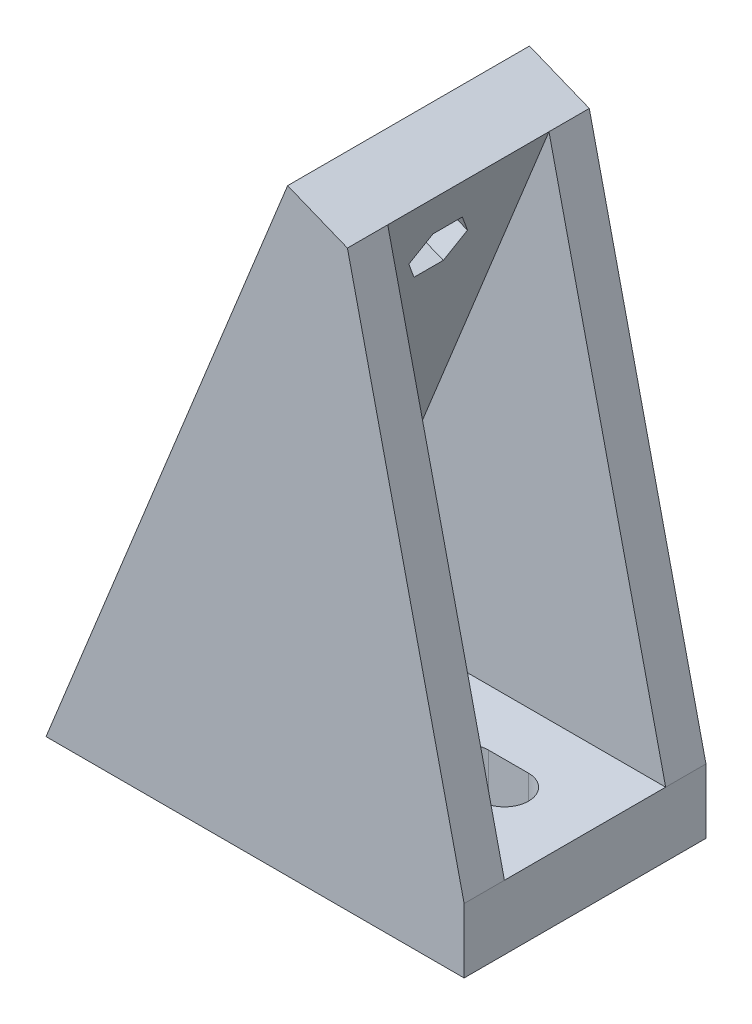
ISO-10303-21;
HEADER;
FILE_DESCRIPTION(('STEP AP214'),'2;1');
FILE_NAME('part.step','',(''),(''),'','','');
FILE_SCHEMA(('AUTOMOTIVE_DESIGN { 1 0 10303 214 1 1 1 1 }'));
ENDSEC;
DATA;
#1=APPLICATION_CONTEXT('core data for automotive mechanical design processes');
#2=APPLICATION_PROTOCOL_DEFINITION('international standard','automotive_design',2000,#1);
#3=PRODUCT_CONTEXT('',#1,'mechanical');
#4=PRODUCT('Part','Part','',(#3));
#5=PRODUCT_RELATED_PRODUCT_CATEGORY('part','',(#4));
#6=PRODUCT_DEFINITION_FORMATION('','',#4);
#7=PRODUCT_DEFINITION_CONTEXT('part definition',#1,'design');
#8=PRODUCT_DEFINITION('design','',#6,#7);
#9=PRODUCT_DEFINITION_SHAPE('','',#8);
#10=(LENGTH_UNIT() NAMED_UNIT(*) SI_UNIT(.MILLI.,.METRE.));
#11=(NAMED_UNIT(*) PLANE_ANGLE_UNIT() SI_UNIT($,.RADIAN.));
#12=(NAMED_UNIT(*) SI_UNIT($,.STERADIAN.) SOLID_ANGLE_UNIT());
#13=UNCERTAINTY_MEASURE_WITH_UNIT(LENGTH_MEASURE(1.E-05),#10,'distance_accuracy_value','');
#14=(GEOMETRIC_REPRESENTATION_CONTEXT(3) GLOBAL_UNCERTAINTY_ASSIGNED_CONTEXT((#13)) GLOBAL_UNIT_ASSIGNED_CONTEXT((#10,
#11,#12)) REPRESENTATION_CONTEXT('',''));
#15=CARTESIAN_POINT('',(0.,0.,0.));
#16=DIRECTION('',(0.,0.,1.));
#17=DIRECTION('',(1.,0.,0.));
#18=AXIS2_PLACEMENT_3D('',#15,#16,#17);
#19=CARTESIAN_POINT('',(16.7826356719322,20.1827436168424,0.));
#20=DIRECTION('',(0.927183854566786,-0.374606593415916,0.));
#21=DIRECTION('',(0.374606593415916,0.927183854566786,0.));
#22=AXIS2_PLACEMENT_3D('',#19,#20,#21);
#23=CYLINDRICAL_SURFACE('',#22,1.69999999999999);
#24=CARTESIAN_POINT('',(9.36516483539776,23.1795963641698,0.));
#25=DIRECTION('',(0.927183854566789,-0.37460659341591,0.));
#26=DIRECTION('',(0.37460659341591,0.927183854566789,0.));
#27=AXIS2_PLACEMENT_3D('',#24,#25,#26);
#28=CIRCLE('',#27,1.69999999999999);
#29=CARTESIAN_POINT('',(10.0019960442048,24.7558089169333,0.));
#30=VERTEX_POINT('',#29);
#31=EDGE_CURVE('E357',#30,#30,#28,.T.);
#32=ORIENTED_EDGE('',*,*,#31,.F.);
#33=EDGE_LOOP('',(#32));
#34=FACE_BOUND('',#33,.T.);
#35=CARTESIAN_POINT('',(14.0010841082319,21.3065633970901,0.));
#36=DIRECTION('',(0.927183854566786,-0.374606593415916,0.));
#37=DIRECTION('',(0.374606593415916,0.927183854566786,0.));
#38=AXIS2_PLACEMENT_3D('',#35,#36,#37);
#39=CIRCLE('',#38,1.69999999999999);
#40=CARTESIAN_POINT('',(14.6379153170389,22.8827759498537,0.));
#41=VERTEX_POINT('',#40);
#42=EDGE_CURVE('E485',#41,#41,#39,.F.);
#43=ORIENTED_EDGE('',*,*,#42,.F.);
#44=EDGE_LOOP('',(#43));
#45=FACE_BOUND('',#44,.T.);
#46=ADVANCED_FACE('F45',(#34,#45),#23,.F.);
#47=CARTESIAN_POINT('',(33.6399323756484,61.9060170723477,0.));
#48=DIRECTION('',(0.927183854566786,-0.374606593415916,0.));
#49=DIRECTION('',(0.374606593415916,0.927183854566786,0.));
#50=AXIS2_PLACEMENT_3D('',#47,#48,#49);
#51=CYLINDRICAL_SURFACE('',#50,1.69999999999999);
#52=CARTESIAN_POINT('',(26.2224615391137,64.9028698196752,0.));
#53=DIRECTION('',(0.927183854566789,-0.37460659341591,0.));
#54=DIRECTION('',(0.37460659341591,0.927183854566789,0.));
#55=AXIS2_PLACEMENT_3D('',#52,#53,#54);
#56=CIRCLE('',#55,1.69999999999999);
#57=CARTESIAN_POINT('',(26.8592927479207,66.4790823724388,0.));
#58=VERTEX_POINT('',#57);
#59=EDGE_CURVE('E481',#58,#58,#56,.T.);
#60=ORIENTED_EDGE('',*,*,#59,.F.);
#61=EDGE_LOOP('',(#60));
#62=FACE_BOUND('',#61,.T.);
#63=CARTESIAN_POINT('',(30.8583808119481,63.0298368525955,0.));
#64=DIRECTION('',(0.927183854566786,-0.374606593415915,0.));
#65=DIRECTION('',(0.374606593415915,0.927183854566786,0.));
#66=AXIS2_PLACEMENT_3D('',#63,#64,#65);
#67=CIRCLE('',#66,1.69999999999999);
#68=CARTESIAN_POINT('',(31.4952120207551,64.606049405359,0.));
#69=VERTEX_POINT('',#68);
#70=EDGE_CURVE('E285',#69,#69,#67,.F.);
#71=ORIENTED_EDGE('',*,*,#70,.F.);
#72=EDGE_LOOP('',(#71));
#73=FACE_BOUND('',#72,.T.);
#74=ADVANCED_FACE('F560',(#62,#73),#51,.F.);
#75=CARTESIAN_POINT('',(11.8604877481019,8.,15.));
#76=DIRECTION('',(0.,-1.,0.));
#77=DIRECTION('',(0.,0.,-1.));
#78=AXIS2_PLACEMENT_3D('',#75,#76,#77);
#79=PLANE('',#78);
#80=DIRECTION('',(-1.,0.,0.));
#81=VECTOR('',#80,1.);
#82=CARTESIAN_POINT('',(41.8604877481019,8.,-3.));
#83=LINE('',#82,#81);
#84=CARTESIAN_POINT('',(41.8604877481019,8.,-3.));
#85=VERTEX_POINT('',#84);
#86=CARTESIAN_POINT('',(36.8604877481019,8.,-3.));
#87=VERTEX_POINT('',#86);
#88=EDGE_CURVE('E407',#85,#87,#83,.T.);
#89=ORIENTED_EDGE('',*,*,#88,.F.);
#90=CARTESIAN_POINT('',(41.8604877481019,8.,0.));
#91=DIRECTION('',(0.,1.,0.));
#92=DIRECTION('',(0.,0.,1.));
#93=AXIS2_PLACEMENT_3D('',#90,#91,#92);
#94=CIRCLE('',#93,3.);
#95=CARTESIAN_POINT('',(41.8604877481019,8.,3.));
#96=VERTEX_POINT('',#95);
#97=EDGE_CURVE('E386',#96,#85,#94,.T.);
#98=ORIENTED_EDGE('',*,*,#97,.F.);
#99=DIRECTION('',(1.,0.,0.));
#100=VECTOR('',#99,1.);
#101=CARTESIAN_POINT('',(41.8604877481019,8.,3.));
#102=LINE('',#101,#100);
#103=CARTESIAN_POINT('',(36.8604877481019,8.,3.));
#104=VERTEX_POINT('',#103);
#105=EDGE_CURVE('E392',#104,#96,#102,.T.);
#106=ORIENTED_EDGE('',*,*,#105,.F.);
#107=CARTESIAN_POINT('',(36.8604877481019,8.,0.));
#108=DIRECTION('',(0.,1.,0.));
#109=DIRECTION('',(0.,0.,1.));
#110=AXIS2_PLACEMENT_3D('',#107,#108,#109);
#111=CIRCLE('',#110,3.);
#112=EDGE_CURVE('E411',#87,#104,#111,.T.);
#113=ORIENTED_EDGE('',*,*,#112,.F.);
#114=EDGE_LOOP('',(#89,#98,#106,#113));
#115=FACE_BOUND('',#114,.T.);
#116=DIRECTION('',(1.,0.,0.));
#117=VECTOR('',#116,1.);
#118=CARTESIAN_POINT('',(11.8604877481019,8.,-10.));
#119=LINE('',#118,#117);
#120=CARTESIAN_POINT('',(26.6860974332292,8.,-10.));
#121=VERTEX_POINT('',#120);
#122=CARTESIAN_POINT('',(51.8604877481019,8.,-10.));
#123=VERTEX_POINT('',#122);
#124=EDGE_CURVE('E369',#121,#123,#119,.T.);
#125=ORIENTED_EDGE('',*,*,#124,.F.);
#126=DIRECTION('',(0.,0.,-1.));
#127=VECTOR('',#126,1.);
#128=CARTESIAN_POINT('',(26.6860974332292,8.,10.));
#129=LINE('',#128,#127);
#130=CARTESIAN_POINT('',(26.6860974332292,8.,10.));
#131=VERTEX_POINT('',#130);
#132=EDGE_CURVE('E501',#121,#131,#129,.F.);
#133=ORIENTED_EDGE('',*,*,#132,.T.);
#134=DIRECTION('',(-1.,0.,0.));
#135=VECTOR('',#134,1.);
#136=CARTESIAN_POINT('',(11.8604877481019,8.,10.));
#137=LINE('',#136,#135);
#138=CARTESIAN_POINT('',(51.8604877481019,8.,10.));
#139=VERTEX_POINT('',#138);
#140=EDGE_CURVE('E382',#139,#131,#137,.T.);
#141=ORIENTED_EDGE('',*,*,#140,.F.);
#142=DIRECTION('',(0.,0.,-1.));
#143=VECTOR('',#142,1.);
#144=CARTESIAN_POINT('',(51.8604877481019,8.,15.));
#145=LINE('',#144,#143);
#146=EDGE_CURVE('E470',#139,#123,#145,.T.);
#147=ORIENTED_EDGE('',*,*,#146,.T.);
#148=EDGE_LOOP('',(#125,#133,#141,#147));
#149=FACE_BOUND('',#148,.T.);
#150=ADVANCED_FACE('F567',(#115,#149),#79,.F.);
#151=CARTESIAN_POINT('',(11.8604877481019,8.,15.));
#152=DIRECTION('',(-0.927183854566788,0.374606593415909,0.));
#153=DIRECTION('',(-0.374606593415909,-0.927183854566789,0.));
#154=AXIS2_PLACEMENT_3D('',#151,#152,#153);
#155=PLANE('',#154);
#156=DIRECTION('',(0.324418826323331,0.802964772033612,0.500000000000001));
#157=VECTOR('',#156,1.);
#158=CARTESIAN_POINT('',(33.6399323756484,61.9060170723477,-3.63730669589465));
#159=LINE('',#158,#157);
#160=CARTESIAN_POINT('',(33.6399323756479,61.9060170723477,-3.63730669589478));
#161=VERTEX_POINT('',#160);
#162=CARTESIAN_POINT('',(34.8199431449086,64.8266462142331,-1.81865334794732));
#163=VERTEX_POINT('',#162);
#164=EDGE_CURVE('E267',#161,#163,#159,.T.);
#165=ORIENTED_EDGE('',*,*,#164,.F.);
#166=DIRECTION('',(0.324418826323331,0.802964772033613,-0.5));
#167=VECTOR('',#166,1.);
#168=CARTESIAN_POINT('',(32.4599216063883,58.9853879304623,-1.81865334794733));
#169=LINE('',#168,#167);
#170=CARTESIAN_POINT('',(32.4599216063883,58.9853879304623,-1.81865334794733));
#171=VERTEX_POINT('',#170);
#172=EDGE_CURVE('E225',#171,#161,#169,.T.);
#173=ORIENTED_EDGE('',*,*,#172,.F.);
#174=DIRECTION('',(0.,0.,-1.));
#175=VECTOR('',#174,1.);
#176=CARTESIAN_POINT('',(32.4599216063883,58.9853879304623,1.81865334794731));
#177=LINE('',#176,#175);
#178=CARTESIAN_POINT('',(32.4599216063883,58.9853879304623,1.81865334794731));
#179=VERTEX_POINT('',#178);
#180=EDGE_CURVE('E247',#179,#171,#177,.T.);
#181=ORIENTED_EDGE('',*,*,#180,.F.);
#182=DIRECTION('',(-0.324418826323331,-0.802964772033613,-0.500000000000001));
#183=VECTOR('',#182,1.);
#184=CARTESIAN_POINT('',(33.6399323756484,61.9060170723477,3.63730669589464));
#185=LINE('',#184,#183);
#186=CARTESIAN_POINT('',(33.6399323756484,61.9060170723477,3.63730669589464));
#187=VERTEX_POINT('',#186);
#188=EDGE_CURVE('E251',#187,#179,#185,.T.);
#189=ORIENTED_EDGE('',*,*,#188,.F.);
#190=DIRECTION('',(-0.324418826323331,-0.802964772033613,0.5));
#191=VECTOR('',#190,1.);
#192=CARTESIAN_POINT('',(34.8199431449086,64.8266462142331,1.81865334794731));
#193=LINE('',#192,#191);
#194=CARTESIAN_POINT('',(34.8199431449086,64.8266462142331,1.81865334794731));
#195=VERTEX_POINT('',#194);
#196=EDGE_CURVE('E275',#195,#187,#193,.T.);
#197=ORIENTED_EDGE('',*,*,#196,.F.);
#198=DIRECTION('',(0.,0.,1.));
#199=VECTOR('',#198,1.);
#200=CARTESIAN_POINT('',(34.8199431449086,64.8266462142331,-1.81865334794732));
#201=LINE('',#200,#199);
#202=EDGE_CURVE('E271',#163,#195,#201,.T.);
#203=ORIENTED_EDGE('',*,*,#202,.F.);
#204=EDGE_LOOP('',(#165,#173,#181,#189,#197,#203));
#205=FACE_BOUND('',#204,.T.);
#206=DIRECTION('',(0.374606593415909,0.927183854566789,0.));
#207=VECTOR('',#206,1.);
#208=CARTESIAN_POINT('',(11.8604877481019,8.,10.));
#209=LINE('',#208,#207);
#210=CARTESIAN_POINT('',(17.4142588875614,21.7460659341591,10.));
#211=VERTEX_POINT('',#210);
#212=CARTESIAN_POINT('',(37.3859983098076,71.1778556180156,10.));
#213=VERTEX_POINT('',#212);
#214=EDGE_CURVE('E376',#211,#213,#209,.T.);
#215=ORIENTED_EDGE('',*,*,#214,.F.);
#216=DIRECTION('',(0.,0.,-1.));
#217=VECTOR('',#216,1.);
#218=CARTESIAN_POINT('',(17.4142588875614,21.7460659341591,-10.));
#219=LINE('',#218,#217);
#220=CARTESIAN_POINT('',(17.4142588875615,21.7460659341591,2.66383788893981));
#221=VERTEX_POINT('',#220);
#222=EDGE_CURVE('E494',#211,#221,#219,.T.);
#223=ORIENTED_EDGE('',*,*,#222,.T.);
#224=DIRECTION('',(-0.324418826323332,-0.802964772033612,0.500000000000001));
#225=VECTOR('',#224,1.);
#226=CARTESIAN_POINT('',(17.9626464411924,23.1033727587277,1.81865334794732));
#227=LINE('',#226,#225);
#228=CARTESIAN_POINT('',(17.9626464411924,23.1033727587277,1.81865334794732));
#229=VERTEX_POINT('',#228);
#230=EDGE_CURVE('E315',#229,#221,#227,.T.);
#231=ORIENTED_EDGE('',*,*,#230,.F.);
#232=DIRECTION('',(0.,0.,1.));
#233=VECTOR('',#232,1.);
#234=CARTESIAN_POINT('',(17.9626464411924,23.1033727587277,-1.81865334794732));
#235=LINE('',#234,#233);
#236=CARTESIAN_POINT('',(17.9626464411924,23.1033727587277,-1.81865334794732));
#237=VERTEX_POINT('',#236);
#238=EDGE_CURVE('E319',#237,#229,#235,.T.);
#239=ORIENTED_EDGE('',*,*,#238,.F.);
#240=DIRECTION('',(0.324418826323332,0.802964772033612,0.500000000000001));
#241=VECTOR('',#240,1.);
#242=CARTESIAN_POINT('',(16.7826356719322,20.1827436168424,-3.63730669589465));
#243=LINE('',#242,#241);
#244=CARTESIAN_POINT('',(17.4142588875614,21.7460659341591,-2.66383788893981));
#245=VERTEX_POINT('',#244);
#246=EDGE_CURVE('E268',#245,#237,#243,.T.);
#247=ORIENTED_EDGE('',*,*,#246,.F.);
#248=DIRECTION('',(0.,0.,-1.));
#249=VECTOR('',#248,1.);
#250=CARTESIAN_POINT('',(17.4142588875614,21.7460659341591,-10.));
#251=LINE('',#250,#249);
#252=CARTESIAN_POINT('',(17.4142588875614,21.7460659341591,-10.));
#253=VERTEX_POINT('',#252);
#254=EDGE_CURVE('E477',#245,#253,#251,.T.);
#255=ORIENTED_EDGE('',*,*,#254,.T.);
#256=DIRECTION('',(-0.374606593415909,-0.927183854566789,0.));
#257=VECTOR('',#256,1.);
#258=CARTESIAN_POINT('',(11.8604877481019,8.,-10.));
#259=LINE('',#258,#257);
#260=CARTESIAN_POINT('',(37.3859983098071,71.1778556180158,-10.));
#261=VERTEX_POINT('',#260);
#262=EDGE_CURVE('E365',#261,#253,#259,.T.);
#263=ORIENTED_EDGE('',*,*,#262,.F.);
#264=DIRECTION('',(0.,0.,-1.));
#265=VECTOR('',#264,1.);
#266=CARTESIAN_POINT('',(37.3859983098071,71.1778556180158,15.));
#267=LINE('',#266,#265);
#268=EDGE_CURVE('E465',#213,#261,#267,.T.);
#269=ORIENTED_EDGE('',*,*,#268,.F.);
#270=EDGE_LOOP('',(#215,#223,#231,#239,#247,#255,#263,#269));
#271=FACE_BOUND('',#270,.T.);
#272=ADVANCED_FACE('F531',(#205,#271),#155,.F.);
#273=CARTESIAN_POINT('',(0.,0.,15.));
#274=DIRECTION('',(0.,1.,0.));
#275=DIRECTION('',(0.,0.,1.));
#276=AXIS2_PLACEMENT_3D('',#273,#274,#275);
#277=PLANE('',#276);
#278=DIRECTION('',(1.,0.,0.));
#279=VECTOR('',#278,1.);
#280=CARTESIAN_POINT('',(0.,0.,-15.));
#281=LINE('',#280,#279);
#282=CARTESIAN_POINT('',(0.,0.,-15.));
#283=VERTEX_POINT('',#282);
#284=CARTESIAN_POINT('',(51.8604877481019,0.,-15.));
#285=VERTEX_POINT('',#284);
#286=EDGE_CURVE('E421',#283,#285,#281,.T.);
#287=ORIENTED_EDGE('',*,*,#286,.T.);
#288=DIRECTION('',(0.,0.,-1.));
#289=VECTOR('',#288,1.);
#290=CARTESIAN_POINT('',(51.8604877481019,0.,15.));
#291=LINE('',#290,#289);
#292=CARTESIAN_POINT('',(51.8604877481019,0.,15.));
#293=VERTEX_POINT('',#292);
#294=EDGE_CURVE('E474',#293,#285,#291,.T.);
#295=ORIENTED_EDGE('',*,*,#294,.F.);
#296=DIRECTION('',(1.,0.,0.));
#297=VECTOR('',#296,1.);
#298=CARTESIAN_POINT('',(0.,0.,15.));
#299=LINE('',#298,#297);
#300=CARTESIAN_POINT('',(0.,0.,15.));
#301=VERTEX_POINT('',#300);
#302=EDGE_CURVE('E431',#301,#293,#299,.T.);
#303=ORIENTED_EDGE('',*,*,#302,.F.);
#304=DIRECTION('',(0.,0.,-1.));
#305=VECTOR('',#304,1.);
#306=CARTESIAN_POINT('',(0.,0.,15.));
#307=LINE('',#306,#305);
#308=EDGE_CURVE('E446',#301,#283,#307,.T.);
#309=ORIENTED_EDGE('',*,*,#308,.T.);
#310=EDGE_LOOP('',(#287,#295,#303,#309));
#311=FACE_BOUND('',#310,.T.);
#312=DIRECTION('',(1.,0.,0.));
#313=VECTOR('',#312,1.);
#314=CARTESIAN_POINT('',(41.8604877481019,0.,3.));
#315=LINE('',#314,#313);
#316=CARTESIAN_POINT('',(36.8604877481019,0.,3.));
#317=VERTEX_POINT('',#316);
#318=CARTESIAN_POINT('',(41.8604877481019,0.,3.));
#319=VERTEX_POINT('',#318);
#320=EDGE_CURVE('E400',#317,#319,#315,.T.);
#321=ORIENTED_EDGE('',*,*,#320,.T.);
#322=CARTESIAN_POINT('',(41.8604877481019,0.,0.));
#323=DIRECTION('',(0.,1.,0.));
#324=DIRECTION('',(0.,0.,1.));
#325=AXIS2_PLACEMENT_3D('',#322,#323,#324);
#326=CIRCLE('',#325,3.);
#327=CARTESIAN_POINT('',(41.8604877481019,0.,-3.));
#328=VERTEX_POINT('',#327);
#329=EDGE_CURVE('E387',#319,#328,#326,.T.);
#330=ORIENTED_EDGE('',*,*,#329,.T.);
#331=DIRECTION('',(-1.,0.,0.));
#332=VECTOR('',#331,1.);
#333=CARTESIAN_POINT('',(41.8604877481019,0.,-3.));
#334=LINE('',#333,#332);
#335=CARTESIAN_POINT('',(36.8604877481019,0.,-3.));
#336=VERTEX_POINT('',#335);
#337=EDGE_CURVE('E391',#328,#336,#334,.T.);
#338=ORIENTED_EDGE('',*,*,#337,.T.);
#339=CARTESIAN_POINT('',(36.8604877481019,0.,0.));
#340=DIRECTION('',(0.,1.,0.));
#341=DIRECTION('',(0.,0.,1.));
#342=AXIS2_PLACEMENT_3D('',#339,#340,#341);
#343=CIRCLE('',#342,3.);
#344=EDGE_CURVE('E396',#336,#317,#343,.T.);
#345=ORIENTED_EDGE('',*,*,#344,.T.);
#346=EDGE_LOOP('',(#321,#330,#338,#345));
#347=FACE_BOUND('',#346,.T.);
#348=ADVANCED_FACE('F624',(#311,#347),#277,.F.);
#349=CARTESIAN_POINT('',(51.8604877481019,0.,15.));
#350=DIRECTION('',(-1.,0.,0.));
#351=DIRECTION('',(0.,0.,1.));
#352=AXIS2_PLACEMENT_3D('',#349,#350,#351);
#353=PLANE('',#352);
#354=DIRECTION('',(0.,0.,-1.));
#355=VECTOR('',#354,1.);
#356=CARTESIAN_POINT('',(51.8604877481019,8.00000000000001,15.));
#357=LINE('',#356,#355);
#358=CARTESIAN_POINT('',(51.8604877481019,8.,-15.));
#359=VERTEX_POINT('',#358);
#360=EDGE_CURVE('E361',#123,#359,#357,.T.);
#361=ORIENTED_EDGE('',*,*,#360,.F.);
#362=ORIENTED_EDGE('',*,*,#146,.F.);
#363=CARTESIAN_POINT('',(51.8604877481019,8.00000000000004,15.));
#364=VERTEX_POINT('',#363);
#365=EDGE_CURVE('E471',#364,#139,#145,.T.);
#366=ORIENTED_EDGE('',*,*,#365,.F.);
#367=DIRECTION('',(0.,1.,0.));
#368=VECTOR('',#367,1.);
#369=CARTESIAN_POINT('',(51.8604877481019,0.,15.));
#370=LINE('',#369,#368);
#371=EDGE_CURVE('E435',#293,#364,#370,.T.);
#372=ORIENTED_EDGE('',*,*,#371,.F.);
#373=ORIENTED_EDGE('',*,*,#294,.T.);
#374=DIRECTION('',(0.,1.,0.));
#375=VECTOR('',#374,1.);
#376=CARTESIAN_POINT('',(51.8604877481019,0.,-15.));
#377=LINE('',#376,#375);
#378=EDGE_CURVE('E450',#285,#359,#377,.T.);
#379=ORIENTED_EDGE('',*,*,#378,.T.);
#380=EDGE_LOOP('',(#361,#362,#366,#372,#373,#379));
#381=FACE_BOUND('',#380,.T.);
#382=ADVANCED_FACE('F620',(#381),#353,.F.);
#383=CARTESIAN_POINT('',(37.3859983098071,71.1778556180158,15.));
#384=DIRECTION('',(-0.374606593415908,-0.927183854566789,0.));
#385=DIRECTION('',(0.927183854566789,-0.374606593415908,0.));
#386=AXIS2_PLACEMENT_3D('',#383,#384,#385);
#387=PLANE('',#386);
#388=DIRECTION('',(-0.927183854566789,0.374606593415908,0.));
#389=VECTOR('',#388,1.);
#390=CARTESIAN_POINT('',(37.3859983098071,71.1778556180158,-15.));
#391=LINE('',#390,#389);
#392=CARTESIAN_POINT('',(37.3859983098071,71.1778556180158,-15.));
#393=VERTEX_POINT('',#392);
#394=CARTESIAN_POINT('',(29.9685274732728,74.1747083653431,-15.));
#395=VERTEX_POINT('',#394);
#396=EDGE_CURVE('E453',#393,#395,#391,.T.);
#397=ORIENTED_EDGE('',*,*,#396,.T.);
#398=DIRECTION('',(0.,0.,-1.));
#399=VECTOR('',#398,1.);
#400=CARTESIAN_POINT('',(29.9685274732728,74.1747083653431,15.));
#401=LINE('',#400,#399);
#402=CARTESIAN_POINT('',(29.9685274732728,74.1747083653431,15.));
#403=VERTEX_POINT('',#402);
#404=EDGE_CURVE('E462',#403,#395,#401,.T.);
#405=ORIENTED_EDGE('',*,*,#404,.F.);
#406=DIRECTION('',(-0.927183854566789,0.374606593415908,0.));
#407=VECTOR('',#406,1.);
#408=CARTESIAN_POINT('',(37.3859983098071,71.1778556180158,15.));
#409=LINE('',#408,#407);
#410=CARTESIAN_POINT('',(37.3859983098071,71.1778556180158,15.));
#411=VERTEX_POINT('',#410);
#412=EDGE_CURVE('E440',#411,#403,#409,.T.);
#413=ORIENTED_EDGE('',*,*,#412,.F.);
#414=EDGE_CURVE('E466',#411,#213,#267,.T.);
#415=ORIENTED_EDGE('',*,*,#414,.T.);
#416=ORIENTED_EDGE('',*,*,#268,.T.);
#417=DIRECTION('',(0.,0.,1.));
#418=VECTOR('',#417,1.);
#419=CARTESIAN_POINT('',(37.3859983098076,71.1778556180156,15.));
#420=LINE('',#419,#418);
#421=EDGE_CURVE('E352',#393,#261,#420,.T.);
#422=ORIENTED_EDGE('',*,*,#421,.F.);
#423=EDGE_LOOP('',(#397,#405,#413,#415,#416,#422));
#424=FACE_BOUND('',#423,.T.);
#425=ADVANCED_FACE('F616',(#424),#387,.F.);
#426=CARTESIAN_POINT('',(0.,0.,15.));
#427=DIRECTION('',(0.927183854566789,-0.37460659341591,0.));
#428=DIRECTION('',(0.37460659341591,0.927183854566789,0.));
#429=AXIS2_PLACEMENT_3D('',#426,#427,#428);
#430=PLANE('',#429);
#431=ORIENTED_EDGE('',*,*,#59,.T.);
#432=EDGE_LOOP('',(#431));
#433=FACE_BOUND('',#432,.T.);
#434=ORIENTED_EDGE('',*,*,#31,.T.);
#435=EDGE_LOOP('',(#434));
#436=FACE_BOUND('',#435,.T.);
#437=DIRECTION('',(-0.37460659341591,-0.927183854566788,0.));
#438=VECTOR('',#437,1.);
#439=CARTESIAN_POINT('',(0.,0.,-15.));
#440=LINE('',#439,#438);
#441=EDGE_CURVE('E436',#395,#283,#440,.T.);
#442=ORIENTED_EDGE('',*,*,#441,.T.);
#443=ORIENTED_EDGE('',*,*,#308,.F.);
#444=DIRECTION('',(-0.37460659341591,-0.927183854566788,0.));
#445=VECTOR('',#444,1.);
#446=CARTESIAN_POINT('',(0.,0.,15.));
#447=LINE('',#446,#445);
#448=EDGE_CURVE('E443',#403,#301,#447,.T.);
#449=ORIENTED_EDGE('',*,*,#448,.F.);
#450=ORIENTED_EDGE('',*,*,#404,.T.);
#451=EDGE_LOOP('',(#442,#443,#449,#450));
#452=FACE_BOUND('',#451,.T.);
#453=ADVANCED_FACE('F610',(#433,#436,#452),#430,.F.);
#454=CARTESIAN_POINT('',(0.,0.,15.));
#455=DIRECTION('',(0.,0.,1.));
#456=DIRECTION('',(1.,0.,0.));
#457=AXIS2_PLACEMENT_3D('',#454,#455,#456);
#458=PLANE('',#457);
#459=ORIENTED_EDGE('',*,*,#302,.T.);
#460=ORIENTED_EDGE('',*,*,#371,.T.);
#461=DIRECTION('',(0.223320905087613,-0.97474497862305,0.));
#462=VECTOR('',#461,1.);
#463=CARTESIAN_POINT('',(37.3859983098076,71.1778556180155,15.));
#464=LINE('',#463,#462);
#465=EDGE_CURVE('E373',#411,#364,#464,.T.);
#466=ORIENTED_EDGE('',*,*,#465,.F.);
#467=ORIENTED_EDGE('',*,*,#412,.T.);
#468=ORIENTED_EDGE('',*,*,#448,.T.);
#469=EDGE_LOOP('',(#459,#460,#466,#467,#468));
#470=FACE_BOUND('',#469,.T.);
#471=ADVANCED_FACE('F607',(#470),#458,.T.);
#472=CARTESIAN_POINT('',(0.,0.,-15.));
#473=DIRECTION('',(0.,0.,1.));
#474=DIRECTION('',(1.,0.,0.));
#475=AXIS2_PLACEMENT_3D('',#472,#473,#474);
#476=PLANE('',#475);
#477=ORIENTED_EDGE('',*,*,#396,.F.);
#478=DIRECTION('',(0.223320905087613,-0.97474497862305,0.));
#479=VECTOR('',#478,1.);
#480=CARTESIAN_POINT('',(37.3859983098076,71.1778556180155,-15.));
#481=LINE('',#480,#479);
#482=EDGE_CURVE('E348',#393,#359,#481,.T.);
#483=ORIENTED_EDGE('',*,*,#482,.T.);
#484=ORIENTED_EDGE('',*,*,#378,.F.);
#485=ORIENTED_EDGE('',*,*,#286,.F.);
#486=ORIENTED_EDGE('',*,*,#441,.F.);
#487=EDGE_LOOP('',(#477,#483,#484,#485,#486));
#488=FACE_BOUND('',#487,.T.);
#489=ADVANCED_FACE('F605',(#488),#476,.F.);
#490=CARTESIAN_POINT('',(41.8604877481019,0.,0.));
#491=DIRECTION('',(0.,1.,0.));
#492=DIRECTION('',(0.,0.,1.));
#493=AXIS2_PLACEMENT_3D('',#490,#491,#492);
#494=CYLINDRICAL_SURFACE('',#493,3.);
#495=ORIENTED_EDGE('',*,*,#97,.T.);
#496=DIRECTION('',(0.,1.,0.));
#497=VECTOR('',#496,1.);
#498=CARTESIAN_POINT('',(41.8604877481019,0.,-3.));
#499=LINE('',#498,#497);
#500=EDGE_CURVE('E404',#328,#85,#499,.T.);
#501=ORIENTED_EDGE('',*,*,#500,.F.);
#502=ORIENTED_EDGE('',*,*,#329,.F.);
#503=DIRECTION('',(0.,1.,0.));
#504=VECTOR('',#503,1.);
#505=CARTESIAN_POINT('',(41.8604877481019,0.,3.));
#506=LINE('',#505,#504);
#507=EDGE_CURVE('E418',#319,#96,#506,.T.);
#508=ORIENTED_EDGE('',*,*,#507,.T.);
#509=EDGE_LOOP('',(#495,#501,#502,#508));
#510=FACE_BOUND('',#509,.T.);
#511=ADVANCED_FACE('F595',(#510),#494,.F.);
#512=CARTESIAN_POINT('',(41.8604877481019,0.,3.));
#513=DIRECTION('',(0.,0.,1.));
#514=DIRECTION('',(1.,0.,0.));
#515=AXIS2_PLACEMENT_3D('',#512,#513,#514);
#516=PLANE('',#515);
#517=ORIENTED_EDGE('',*,*,#105,.T.);
#518=ORIENTED_EDGE('',*,*,#507,.F.);
#519=ORIENTED_EDGE('',*,*,#320,.F.);
#520=DIRECTION('',(0.,1.,0.));
#521=VECTOR('',#520,1.);
#522=CARTESIAN_POINT('',(36.8604877481019,0.,3.));
#523=LINE('',#522,#521);
#524=EDGE_CURVE('E422',#317,#104,#523,.T.);
#525=ORIENTED_EDGE('',*,*,#524,.T.);
#526=EDGE_LOOP('',(#517,#518,#519,#525));
#527=FACE_BOUND('',#526,.T.);
#528=ADVANCED_FACE('F591',(#527),#516,.F.);
#529=CARTESIAN_POINT('',(36.8604877481019,0.,0.));
#530=DIRECTION('',(0.,1.,0.));
#531=DIRECTION('',(0.,0.,1.));
#532=AXIS2_PLACEMENT_3D('',#529,#530,#531);
#533=CYLINDRICAL_SURFACE('',#532,3.);
#534=ORIENTED_EDGE('',*,*,#112,.T.);
#535=ORIENTED_EDGE('',*,*,#524,.F.);
#536=ORIENTED_EDGE('',*,*,#344,.F.);
#537=DIRECTION('',(0.,1.,0.));
#538=VECTOR('',#537,1.);
#539=CARTESIAN_POINT('',(36.8604877481019,0.,-3.));
#540=LINE('',#539,#538);
#541=EDGE_CURVE('E425',#336,#87,#540,.T.);
#542=ORIENTED_EDGE('',*,*,#541,.T.);
#543=EDGE_LOOP('',(#534,#535,#536,#542));
#544=FACE_BOUND('',#543,.T.);
#545=ADVANCED_FACE('F594',(#544),#533,.F.);
#546=CARTESIAN_POINT('',(41.8604877481019,0.,-3.));
#547=DIRECTION('',(0.,0.,-1.));
#548=DIRECTION('',(-1.,0.,0.));
#549=AXIS2_PLACEMENT_3D('',#546,#547,#548);
#550=PLANE('',#549);
#551=ORIENTED_EDGE('',*,*,#88,.T.);
#552=ORIENTED_EDGE('',*,*,#541,.F.);
#553=ORIENTED_EDGE('',*,*,#337,.F.);
#554=ORIENTED_EDGE('',*,*,#500,.T.);
#555=EDGE_LOOP('',(#551,#552,#553,#554));
#556=FACE_BOUND('',#555,.T.);
#557=ADVANCED_FACE('F586',(#556),#550,.F.);
#558=CARTESIAN_POINT('',(25.9302438740509,37.0873541826715,10.));
#559=DIRECTION('',(0.,0.,1.));
#560=DIRECTION('',(1.,0.,0.));
#561=AXIS2_PLACEMENT_3D('',#558,#559,#560);
#562=PLANE('',#561);
#563=ORIENTED_EDGE('',*,*,#140,.T.);
#564=CARTESIAN_POINT('',(26.6860974332292,18.,10.));
#565=DIRECTION('',(0.,0.,1.));
#566=DIRECTION('',(1.,0.,0.));
#567=AXIS2_PLACEMENT_3D('',#564,#565,#566);
#568=CIRCLE('',#567,10.);
#569=EDGE_CURVE('E504',#131,#211,#568,.F.);
#570=ORIENTED_EDGE('',*,*,#569,.T.);
#571=ORIENTED_EDGE('',*,*,#214,.T.);
#572=DIRECTION('',(0.223320905087613,-0.97474497862305,0.));
#573=VECTOR('',#572,1.);
#574=CARTESIAN_POINT('',(37.3859983098076,71.1778556180155,10.));
#575=LINE('',#574,#573);
#576=EDGE_CURVE('E372',#213,#139,#575,.T.);
#577=ORIENTED_EDGE('',*,*,#576,.T.);
#578=EDGE_LOOP('',(#563,#570,#571,#577));
#579=FACE_BOUND('',#578,.T.);
#580=ADVANCED_FACE('F583',(#579),#562,.F.);
#581=CARTESIAN_POINT('',(37.3859983098076,71.1778556180155,15.));
#582=DIRECTION('',(-0.97474497862305,-0.223320905087613,0.));
#583=DIRECTION('',(0.223320905087613,-0.97474497862305,0.));
#584=AXIS2_PLACEMENT_3D('',#581,#582,#583);
#585=PLANE('',#584);
#586=ORIENTED_EDGE('',*,*,#365,.T.);
#587=ORIENTED_EDGE('',*,*,#576,.F.);
#588=ORIENTED_EDGE('',*,*,#414,.F.);
#589=ORIENTED_EDGE('',*,*,#465,.T.);
#590=EDGE_LOOP('',(#586,#587,#588,#589));
#591=FACE_BOUND('',#590,.T.);
#592=ADVANCED_FACE('F578',(#591),#585,.F.);
#593=CARTESIAN_POINT('',(25.9302438740509,37.0873541826715,-10.));
#594=DIRECTION('',(0.,0.,-1.));
#595=DIRECTION('',(-1.,0.,0.));
#596=AXIS2_PLACEMENT_3D('',#593,#594,#595);
#597=PLANE('',#596);
#598=ORIENTED_EDGE('',*,*,#262,.T.);
#599=CARTESIAN_POINT('',(26.6860974332292,18.,-10.));
#600=DIRECTION('',(0.,0.,-1.));
#601=DIRECTION('',(-1.,0.,0.));
#602=AXIS2_PLACEMENT_3D('',#599,#600,#601);
#603=CIRCLE('',#602,10.);
#604=EDGE_CURVE('E498',#253,#121,#603,.F.);
#605=ORIENTED_EDGE('',*,*,#604,.T.);
#606=ORIENTED_EDGE('',*,*,#124,.T.);
#607=DIRECTION('',(0.223320905087613,-0.97474497862305,0.));
#608=VECTOR('',#607,1.);
#609=CARTESIAN_POINT('',(37.3859983098076,71.1778556180155,-10.));
#610=LINE('',#609,#608);
#611=EDGE_CURVE('E353',#261,#123,#610,.T.);
#612=ORIENTED_EDGE('',*,*,#611,.F.);
#613=EDGE_LOOP('',(#598,#605,#606,#612));
#614=FACE_BOUND('',#613,.T.);
#615=ADVANCED_FACE('F574',(#614),#597,.F.);
#616=CARTESIAN_POINT('',(37.3859983098076,71.1778556180155,-15.));
#617=DIRECTION('',(0.97474497862305,0.223320905087613,0.));
#618=DIRECTION('',(0.223320905087613,-0.97474497862305,0.));
#619=AXIS2_PLACEMENT_3D('',#616,#617,#618);
#620=PLANE('',#619);
#621=ORIENTED_EDGE('',*,*,#611,.T.);
#622=ORIENTED_EDGE('',*,*,#360,.T.);
#623=ORIENTED_EDGE('',*,*,#482,.F.);
#624=ORIENTED_EDGE('',*,*,#421,.T.);
#625=EDGE_LOOP('',(#621,#622,#623,#624));
#626=FACE_BOUND('',#625,.T.);
#627=ADVANCED_FACE('F577',(#626),#620,.T.);
#628=CARTESIAN_POINT('',(4.635919272834,-1.8730329670796,0.));
#629=DIRECTION('',(0.927183854566786,-0.374606593415915,0.));
#630=DIRECTION('',(0.374606593415915,0.927183854566786,0.));
#631=AXIS2_PLACEMENT_3D('',#628,#629,#630);
#632=PLANE('',#631);
#633=DIRECTION('',(0.324418826323331,0.802964772033613,-0.5));
#634=VECTOR('',#633,1.);
#635=CARTESIAN_POINT('',(29.6783700426879,60.1092077107101,-1.81865334794733));
#636=LINE('',#635,#634);
#637=CARTESIAN_POINT('',(29.6783700426879,60.1092077107101,-1.81865334794733));
#638=VERTEX_POINT('',#637);
#639=CARTESIAN_POINT('',(30.8583808119481,63.0298368525955,-3.63730669589465));
#640=VERTEX_POINT('',#639);
#641=EDGE_CURVE('E222',#638,#640,#636,.T.);
#642=ORIENTED_EDGE('',*,*,#641,.T.);
#643=DIRECTION('',(0.324418826323331,0.802964772033612,0.500000000000001));
#644=VECTOR('',#643,1.);
#645=CARTESIAN_POINT('',(30.8583808119481,63.0298368525955,-3.63730669589465));
#646=LINE('',#645,#644);
#647=CARTESIAN_POINT('',(32.0383915812082,65.9504659944809,-1.81865334794732));
#648=VERTEX_POINT('',#647);
#649=EDGE_CURVE('E234',#640,#648,#646,.T.);
#650=ORIENTED_EDGE('',*,*,#649,.T.);
#651=DIRECTION('',(0.,0.,1.));
#652=VECTOR('',#651,1.);
#653=CARTESIAN_POINT('',(32.0383915812082,65.9504659944809,-1.81865334794732));
#654=LINE('',#653,#652);
#655=CARTESIAN_POINT('',(32.0383915812082,65.9504659944809,1.81865334794731));
#656=VERTEX_POINT('',#655);
#657=EDGE_CURVE('E240',#648,#656,#654,.T.);
#658=ORIENTED_EDGE('',*,*,#657,.T.);
#659=DIRECTION('',(-0.324418826323331,-0.802964772033613,0.5));
#660=VECTOR('',#659,1.);
#661=CARTESIAN_POINT('',(32.0383915812082,65.9504659944809,1.81865334794731));
#662=LINE('',#661,#660);
#663=CARTESIAN_POINT('',(30.8583808119481,63.0298368525955,3.63730669589464));
#664=VERTEX_POINT('',#663);
#665=EDGE_CURVE('E256',#656,#664,#662,.T.);
#666=ORIENTED_EDGE('',*,*,#665,.T.);
#667=DIRECTION('',(-0.324418826323331,-0.802964772033613,-0.500000000000001));
#668=VECTOR('',#667,1.);
#669=CARTESIAN_POINT('',(30.8583808119481,63.0298368525955,3.63730669589464));
#670=LINE('',#669,#668);
#671=CARTESIAN_POINT('',(29.6783700426879,60.1092077107101,1.81865334794731));
#672=VERTEX_POINT('',#671);
#673=EDGE_CURVE('E260',#664,#672,#670,.T.);
#674=ORIENTED_EDGE('',*,*,#673,.T.);
#675=DIRECTION('',(0.,0.,-1.));
#676=VECTOR('',#675,1.);
#677=CARTESIAN_POINT('',(29.6783700426879,60.1092077107101,1.81865334794731));
#678=LINE('',#677,#676);
#679=EDGE_CURVE('E231',#672,#638,#678,.T.);
#680=ORIENTED_EDGE('',*,*,#679,.T.);
#681=EDGE_LOOP('',(#642,#650,#658,#666,#674,#680));
#682=FACE_BOUND('',#681,.T.);
#683=ORIENTED_EDGE('',*,*,#70,.T.);
#684=EDGE_LOOP('',(#683));
#685=FACE_BOUND('',#684,.T.);
#686=ADVANCED_FACE('F242',(#682,#685),#632,.T.);
#687=CARTESIAN_POINT('',(29.6783700426879,60.1092077107101,-1.81865334794733));
#688=DIRECTION('',(-0.187303296707958,-0.463591927283393,-0.866025403784439));
#689=DIRECTION('',(0.,0.881628347468898,-0.471944336695823));
#690=AXIS2_PLACEMENT_3D('',#687,#688,#689);
#691=PLANE('',#690);
#692=ORIENTED_EDGE('',*,*,#172,.T.);
#693=DIRECTION('',(0.927183854566786,-0.374606593415916,0.));
#694=VECTOR('',#693,1.);
#695=CARTESIAN_POINT('',(30.8583808119481,63.0298368525955,-3.63730669589465));
#696=LINE('',#695,#694);
#697=EDGE_CURVE('E218',#640,#161,#696,.T.);
#698=ORIENTED_EDGE('',*,*,#697,.F.);
#699=ORIENTED_EDGE('',*,*,#641,.F.);
#700=DIRECTION('',(0.927183854566786,-0.374606593415916,0.));
#701=VECTOR('',#700,1.);
#702=CARTESIAN_POINT('',(29.6783700426879,60.1092077107101,-1.81865334794733));
#703=LINE('',#702,#701);
#704=EDGE_CURVE('E282',#638,#171,#703,.T.);
#705=ORIENTED_EDGE('',*,*,#704,.T.);
#706=EDGE_LOOP('',(#692,#698,#699,#705));
#707=FACE_BOUND('',#706,.T.);
#708=ADVANCED_FACE('F220',(#707),#691,.F.);
#709=CARTESIAN_POINT('',(29.6783700426879,60.1092077107101,1.81865334794731));
#710=DIRECTION('',(-0.374606593415916,-0.927183854566786,0.));
#711=DIRECTION('',(0.927183854566786,-0.374606593415916,0.));
#712=AXIS2_PLACEMENT_3D('',#709,#710,#711);
#713=PLANE('',#712);
#714=ORIENTED_EDGE('',*,*,#180,.T.);
#715=ORIENTED_EDGE('',*,*,#704,.F.);
#716=ORIENTED_EDGE('',*,*,#679,.F.);
#717=DIRECTION('',(0.927183854566786,-0.374606593415916,0.));
#718=VECTOR('',#717,1.);
#719=CARTESIAN_POINT('',(29.6783700426879,60.1092077107101,1.81865334794731));
#720=LINE('',#719,#718);
#721=EDGE_CURVE('E286',#672,#179,#720,.T.);
#722=ORIENTED_EDGE('',*,*,#721,.T.);
#723=EDGE_LOOP('',(#714,#715,#716,#722));
#724=FACE_BOUND('',#723,.T.);
#725=ADVANCED_FACE('F786',(#724),#713,.F.);
#726=CARTESIAN_POINT('',(30.8583808119481,63.0298368525955,3.63730669589464));
#727=DIRECTION('',(-0.187303296707958,-0.463591927283393,0.866025403784438));
#728=DIRECTION('',(0.,-0.881628347468898,-0.471944336695824));
#729=AXIS2_PLACEMENT_3D('',#726,#727,#728);
#730=PLANE('',#729);
#731=ORIENTED_EDGE('',*,*,#188,.T.);
#732=ORIENTED_EDGE('',*,*,#721,.F.);
#733=ORIENTED_EDGE('',*,*,#673,.F.);
#734=DIRECTION('',(0.927183854566786,-0.374606593415916,0.));
#735=VECTOR('',#734,1.);
#736=CARTESIAN_POINT('',(30.8583808119481,63.0298368525955,3.63730669589464));
#737=LINE('',#736,#735);
#738=EDGE_CURVE('E289',#664,#187,#737,.T.);
#739=ORIENTED_EDGE('',*,*,#738,.T.);
#740=EDGE_LOOP('',(#731,#732,#733,#739));
#741=FACE_BOUND('',#740,.T.);
#742=ADVANCED_FACE('F794',(#741),#730,.F.);
#743=CARTESIAN_POINT('',(32.0383915812082,65.9504659944809,1.81865334794731));
#744=DIRECTION('',(0.187303296707958,0.463591927283393,0.866025403784439));
#745=DIRECTION('',(0.,-0.881628347468898,0.471944336695823));
#746=AXIS2_PLACEMENT_3D('',#743,#744,#745);
#747=PLANE('',#746);
#748=ORIENTED_EDGE('',*,*,#196,.T.);
#749=ORIENTED_EDGE('',*,*,#738,.F.);
#750=ORIENTED_EDGE('',*,*,#665,.F.);
#751=DIRECTION('',(0.927183854566786,-0.374606593415916,0.));
#752=VECTOR('',#751,1.);
#753=CARTESIAN_POINT('',(32.0383915812082,65.9504659944809,1.81865334794731));
#754=LINE('',#753,#752);
#755=EDGE_CURVE('E292',#656,#195,#754,.T.);
#756=ORIENTED_EDGE('',*,*,#755,.T.);
#757=EDGE_LOOP('',(#748,#749,#750,#756));
#758=FACE_BOUND('',#757,.T.);
#759=ADVANCED_FACE('F803',(#758),#747,.F.);
#760=CARTESIAN_POINT('',(32.0383915812082,65.9504659944809,-1.81865334794732));
#761=DIRECTION('',(0.374606593415916,0.927183854566786,0.));
#762=DIRECTION('',(-0.927183854566786,0.374606593415916,0.));
#763=AXIS2_PLACEMENT_3D('',#760,#761,#762);
#764=PLANE('',#763);
#765=ORIENTED_EDGE('',*,*,#202,.T.);
#766=ORIENTED_EDGE('',*,*,#755,.F.);
#767=ORIENTED_EDGE('',*,*,#657,.F.);
#768=DIRECTION('',(0.927183854566786,-0.374606593415916,0.));
#769=VECTOR('',#768,1.);
#770=CARTESIAN_POINT('',(32.0383915812082,65.9504659944809,-1.81865334794732));
#771=LINE('',#770,#769);
#772=EDGE_CURVE('E230',#648,#163,#771,.T.);
#773=ORIENTED_EDGE('',*,*,#772,.T.);
#774=EDGE_LOOP('',(#765,#766,#767,#773));
#775=FACE_BOUND('',#774,.T.);
#776=ADVANCED_FACE('F812',(#775),#764,.F.);
#777=CARTESIAN_POINT('',(30.8583808119481,63.0298368525955,-3.63730669589465));
#778=DIRECTION('',(0.187303296707959,0.463591927283394,-0.866025403784438));
#779=DIRECTION('',(0.,0.881628347468897,0.471944336695824));
#780=AXIS2_PLACEMENT_3D('',#777,#778,#779);
#781=PLANE('',#780);
#782=ORIENTED_EDGE('',*,*,#164,.T.);
#783=ORIENTED_EDGE('',*,*,#772,.F.);
#784=ORIENTED_EDGE('',*,*,#649,.F.);
#785=ORIENTED_EDGE('',*,*,#697,.T.);
#786=EDGE_LOOP('',(#782,#783,#784,#785));
#787=FACE_BOUND('',#786,.T.);
#788=ADVANCED_FACE('F235',(#787),#781,.F.);
#789=CARTESIAN_POINT('',(4.63591927283394,-1.87303296707958,0.));
#790=DIRECTION('',(0.927183854566786,-0.374606593415916,0.));
#791=DIRECTION('',(0.374606593415916,0.927183854566786,0.));
#792=AXIS2_PLACEMENT_3D('',#789,#790,#791);
#793=PLANE('',#792);
#794=DIRECTION('',(0.324418826323331,0.802964772033613,-0.5));
#795=VECTOR('',#794,1.);
#796=CARTESIAN_POINT('',(12.8210733389717,18.3859342552047,-1.81865334794732));
#797=LINE('',#796,#795);
#798=CARTESIAN_POINT('',(12.8210733389717,18.3859342552047,-1.81865334794732));
#799=VERTEX_POINT('',#798);
#800=CARTESIAN_POINT('',(14.0010841082319,21.3065633970901,-3.63730669589465));
#801=VERTEX_POINT('',#800);
#802=EDGE_CURVE('E320',#799,#801,#797,.T.);
#803=ORIENTED_EDGE('',*,*,#802,.T.);
#804=DIRECTION('',(0.324418826323332,0.802964772033612,0.500000000000001));
#805=VECTOR('',#804,1.);
#806=CARTESIAN_POINT('',(14.0010841082319,21.3065633970901,-3.63730669589465));
#807=LINE('',#806,#805);
#808=CARTESIAN_POINT('',(15.181094877492,24.2271925389755,-1.81865334794732));
#809=VERTEX_POINT('',#808);
#810=EDGE_CURVE('E341',#801,#809,#807,.T.);
#811=ORIENTED_EDGE('',*,*,#810,.T.);
#812=DIRECTION('',(0.,0.,1.));
#813=VECTOR('',#812,1.);
#814=CARTESIAN_POINT('',(15.181094877492,24.2271925389755,-1.81865334794732));
#815=LINE('',#814,#813);
#816=CARTESIAN_POINT('',(15.181094877492,24.2271925389755,1.81865334794732));
#817=VERTEX_POINT('',#816);
#818=EDGE_CURVE('E337',#809,#817,#815,.T.);
#819=ORIENTED_EDGE('',*,*,#818,.T.);
#820=DIRECTION('',(-0.324418826323332,-0.802964772033612,0.500000000000001));
#821=VECTOR('',#820,1.);
#822=CARTESIAN_POINT('',(15.181094877492,24.2271925389755,1.81865334794732));
#823=LINE('',#822,#821);
#824=CARTESIAN_POINT('',(14.0010841082319,21.3065633970901,3.63730669589465));
#825=VERTEX_POINT('',#824);
#826=EDGE_CURVE('E333',#817,#825,#823,.T.);
#827=ORIENTED_EDGE('',*,*,#826,.T.);
#828=DIRECTION('',(-0.324418826323331,-0.802964772033613,-0.499999999999999));
#829=VECTOR('',#828,1.);
#830=CARTESIAN_POINT('',(14.0010841082319,21.3065633970901,3.63730669589465));
#831=LINE('',#830,#829);
#832=CARTESIAN_POINT('',(12.8210733389717,18.3859342552047,1.81865334794733));
#833=VERTEX_POINT('',#832);
#834=EDGE_CURVE('E329',#825,#833,#831,.T.);
#835=ORIENTED_EDGE('',*,*,#834,.T.);
#836=DIRECTION('',(0.,0.,-1.));
#837=VECTOR('',#836,1.);
#838=CARTESIAN_POINT('',(12.8210733389717,18.3859342552047,1.81865334794733));
#839=LINE('',#838,#837);
#840=EDGE_CURVE('E299',#833,#799,#839,.T.);
#841=ORIENTED_EDGE('',*,*,#840,.T.);
#842=EDGE_LOOP('',(#803,#811,#819,#827,#835,#841));
#843=FACE_BOUND('',#842,.T.);
#844=ORIENTED_EDGE('',*,*,#42,.T.);
#845=EDGE_LOOP('',(#844));
#846=FACE_BOUND('',#845,.T.);
#847=ADVANCED_FACE('F538',(#843,#846),#793,.T.);
#848=CARTESIAN_POINT('',(12.8210733389717,18.3859342552047,-1.81865334794732));
#849=DIRECTION('',(-0.187303296707958,-0.463591927283393,-0.866025403784439));
#850=DIRECTION('',(0.,0.881628347468898,-0.471944336695823));
#851=AXIS2_PLACEMENT_3D('',#848,#849,#850);
#852=PLANE('',#851);
#853=DIRECTION('',(0.927183854566786,-0.374606593415916,0.));
#854=VECTOR('',#853,1.);
#855=CARTESIAN_POINT('',(12.8210733389717,18.3859342552047,-1.81865334794732));
#856=LINE('',#855,#854);
#857=CARTESIAN_POINT('',(16.7589739789084,16.7949191219373,-1.81865334794732));
#858=VERTEX_POINT('',#857);
#859=EDGE_CURVE('E67',#799,#858,#856,.T.);
#860=ORIENTED_EDGE('',*,*,#859,.T.);
#861=CARTESIAN_POINT('',(26.6860974332292,18.,-4.61077550284953));
#862=DIRECTION('',(-0.187303296707958,-0.463591927283393,-0.866025403784439));
#863=DIRECTION('',(-0.324418826323332,-0.802964772033613,0.5));
#864=AXIS2_PLACEMENT_3D('',#861,#862,#863);
#865=ELLIPSE('',#864,11.5470053837925,10.);
#866=CARTESIAN_POINT('',(16.9153816286657,20.1291107689485,-3.63730669589465));
#867=VERTEX_POINT('',#866);
#868=EDGE_CURVE('E54',#858,#867,#865,.T.);
#869=ORIENTED_EDGE('',*,*,#868,.T.);
#870=DIRECTION('',(0.927183854566786,-0.374606593415916,0.));
#871=VECTOR('',#870,1.);
#872=CARTESIAN_POINT('',(14.0010841082319,21.3065633970901,-3.63730669589465));
#873=LINE('',#872,#871);
#874=EDGE_CURVE('E60',#801,#867,#873,.T.);
#875=ORIENTED_EDGE('',*,*,#874,.F.);
#876=ORIENTED_EDGE('',*,*,#802,.F.);
#877=EDGE_LOOP('',(#860,#869,#875,#876));
#878=FACE_BOUND('',#877,.T.);
#879=ADVANCED_FACE('F520',(#878),#852,.F.);
#880=CARTESIAN_POINT('',(12.8210733389717,18.3859342552047,1.81865334794733));
#881=DIRECTION('',(-0.374606593415916,-0.927183854566786,0.));
#882=DIRECTION('',(0.927183854566786,-0.374606593415916,0.));
#883=AXIS2_PLACEMENT_3D('',#880,#881,#882);
#884=PLANE('',#883);
#885=DIRECTION('',(0.927183854566786,-0.374606593415916,0.));
#886=VECTOR('',#885,1.);
#887=CARTESIAN_POINT('',(12.8210733389717,18.3859342552047,1.81865334794733));
#888=LINE('',#887,#886);
#889=CARTESIAN_POINT('',(16.7589739789084,16.7949191219373,1.81865334794733));
#890=VERTEX_POINT('',#889);
#891=EDGE_CURVE('E310',#833,#890,#888,.T.);
#892=ORIENTED_EDGE('',*,*,#891,.T.);
#893=DIRECTION('',(0.,0.,1.));
#894=VECTOR('',#893,1.);
#895=CARTESIAN_POINT('',(16.7589739789084,16.7949191219373,1.81865334794733));
#896=LINE('',#895,#894);
#897=EDGE_CURVE('E515',#890,#858,#896,.F.);
#898=ORIENTED_EDGE('',*,*,#897,.T.);
#899=ORIENTED_EDGE('',*,*,#859,.F.);
#900=ORIENTED_EDGE('',*,*,#840,.F.);
#901=EDGE_LOOP('',(#892,#898,#899,#900));
#902=FACE_BOUND('',#901,.T.);
#903=ADVANCED_FACE('F543',(#902),#884,.F.);
#904=CARTESIAN_POINT('',(14.0010841082319,21.3065633970901,3.63730669589465));
#905=DIRECTION('',(-0.187303296707958,-0.463591927283392,0.866025403784439));
#906=DIRECTION('',(0.,-0.881628347468898,-0.471944336695822));
#907=AXIS2_PLACEMENT_3D('',#904,#905,#906);
#908=PLANE('',#907);
#909=DIRECTION('',(0.927183854566786,-0.374606593415916,0.));
#910=VECTOR('',#909,1.);
#911=CARTESIAN_POINT('',(14.0010841082319,21.3065633970901,3.63730669589465));
#912=LINE('',#911,#910);
#913=CARTESIAN_POINT('',(16.9153816286657,20.1291107689485,3.63730669589465));
#914=VERTEX_POINT('',#913);
#915=EDGE_CURVE('E307',#825,#914,#912,.T.);
#916=ORIENTED_EDGE('',*,*,#915,.T.);
#917=CARTESIAN_POINT('',(26.6860974332292,18.,4.61077550284953));
#918=DIRECTION('',(-0.187303296707958,-0.463591927283392,0.866025403784439));
#919=DIRECTION('',(0.324418826323332,0.802964772033613,0.5));
#920=AXIS2_PLACEMENT_3D('',#917,#918,#919);
#921=ELLIPSE('',#920,11.5470053837925,10.);
#922=EDGE_CURVE('E511',#914,#890,#921,.T.);
#923=ORIENTED_EDGE('',*,*,#922,.T.);
#924=ORIENTED_EDGE('',*,*,#891,.F.);
#925=ORIENTED_EDGE('',*,*,#834,.F.);
#926=EDGE_LOOP('',(#916,#923,#924,#925));
#927=FACE_BOUND('',#926,.T.);
#928=ADVANCED_FACE('F547',(#927),#908,.F.);
#929=CARTESIAN_POINT('',(15.181094877492,24.2271925389755,1.81865334794732));
#930=DIRECTION('',(0.187303296707958,0.463591927283394,0.866025403784438));
#931=DIRECTION('',(0.,-0.881628347468897,0.471944336695824));
#932=AXIS2_PLACEMENT_3D('',#929,#930,#931);
#933=PLANE('',#932);
#934=ORIENTED_EDGE('',*,*,#230,.T.);
#935=CARTESIAN_POINT('',(26.6860974332292,18.,2.66383788893976));
#936=DIRECTION('',(0.187303296707958,0.463591927283394,0.866025403784438));
#937=DIRECTION('',(-0.324418826323332,-0.802964772033612,0.500000000000001));
#938=AXIS2_PLACEMENT_3D('',#935,#936,#937);
#939=ELLIPSE('',#938,11.5470053837925,10.);
#940=EDGE_CURVE('E507',#221,#914,#939,.T.);
#941=ORIENTED_EDGE('',*,*,#940,.T.);
#942=ORIENTED_EDGE('',*,*,#915,.F.);
#943=ORIENTED_EDGE('',*,*,#826,.F.);
#944=DIRECTION('',(0.927183854566786,-0.374606593415916,0.));
#945=VECTOR('',#944,1.);
#946=CARTESIAN_POINT('',(15.181094877492,24.2271925389755,1.81865334794732));
#947=LINE('',#946,#945);
#948=EDGE_CURVE('E304',#817,#229,#947,.T.);
#949=ORIENTED_EDGE('',*,*,#948,.T.);
#950=EDGE_LOOP('',(#934,#941,#942,#943,#949));
#951=FACE_BOUND('',#950,.T.);
#952=ADVANCED_FACE('F549',(#951),#933,.F.);
#953=CARTESIAN_POINT('',(15.181094877492,24.2271925389755,-1.81865334794732));
#954=DIRECTION('',(0.374606593415916,0.927183854566786,0.));
#955=DIRECTION('',(-0.927183854566786,0.374606593415916,0.));
#956=AXIS2_PLACEMENT_3D('',#953,#954,#955);
#957=PLANE('',#956);
#958=ORIENTED_EDGE('',*,*,#238,.T.);
#959=ORIENTED_EDGE('',*,*,#948,.F.);
#960=ORIENTED_EDGE('',*,*,#818,.F.);
#961=DIRECTION('',(0.927183854566786,-0.374606593415916,0.));
#962=VECTOR('',#961,1.);
#963=CARTESIAN_POINT('',(15.181094877492,24.2271925389755,-1.81865334794732));
#964=LINE('',#963,#962);
#965=EDGE_CURVE('E300',#809,#237,#964,.T.);
#966=ORIENTED_EDGE('',*,*,#965,.T.);
#967=EDGE_LOOP('',(#958,#959,#960,#966));
#968=FACE_BOUND('',#967,.T.);
#969=ADVANCED_FACE('F534',(#968),#957,.F.);
#970=CARTESIAN_POINT('',(14.0010841082319,21.3065633970901,-3.63730669589465));
#971=DIRECTION('',(0.187303296707958,0.463591927283393,-0.866025403784438));
#972=DIRECTION('',(0.,0.881628347468898,0.471944336695823));
#973=AXIS2_PLACEMENT_3D('',#970,#971,#972);
#974=PLANE('',#973);
#975=ORIENTED_EDGE('',*,*,#874,.T.);
#976=CARTESIAN_POINT('',(26.6860974332292,18.,-2.66383788893977));
#977=DIRECTION('',(0.187303296707958,0.463591927283393,-0.866025403784438));
#978=DIRECTION('',(0.324418826323332,0.802964772033613,0.500000000000001));
#979=AXIS2_PLACEMENT_3D('',#976,#977,#978);
#980=ELLIPSE('',#979,11.5470053837925,10.);
#981=EDGE_CURVE('E11',#867,#245,#980,.T.);
#982=ORIENTED_EDGE('',*,*,#981,.T.);
#983=ORIENTED_EDGE('',*,*,#246,.T.);
#984=ORIENTED_EDGE('',*,*,#965,.F.);
#985=ORIENTED_EDGE('',*,*,#810,.F.);
#986=EDGE_LOOP('',(#975,#982,#983,#984,#985));
#987=FACE_BOUND('',#986,.T.);
#988=ADVANCED_FACE('F527',(#987),#974,.F.);
#989=CARTESIAN_POINT('',(26.6860974332292,18.,15.));
#990=DIRECTION('',(0.,0.,1.));
#991=DIRECTION('',(1.,0.,0.));
#992=AXIS2_PLACEMENT_3D('',#989,#990,#991);
#993=CYLINDRICAL_SURFACE('',#992,10.);
#994=ORIENTED_EDGE('',*,*,#569,.F.);
#995=ORIENTED_EDGE('',*,*,#132,.F.);
#996=ORIENTED_EDGE('',*,*,#604,.F.);
#997=ORIENTED_EDGE('',*,*,#254,.F.);
#998=ORIENTED_EDGE('',*,*,#981,.F.);
#999=ORIENTED_EDGE('',*,*,#868,.F.);
#1000=ORIENTED_EDGE('',*,*,#897,.F.);
#1001=ORIENTED_EDGE('',*,*,#922,.F.);
#1002=ORIENTED_EDGE('',*,*,#940,.F.);
#1003=ORIENTED_EDGE('',*,*,#222,.F.);
#1004=EDGE_LOOP('',(#994,#995,#996,#997,#998,#999,#1000,#1001,#1002,#1003));
#1005=FACE_BOUND('',#1004,.T.);
#1006=ADVANCED_FACE('F47',(#1005),#993,.F.);
#1007=CLOSED_SHELL('',(#46,#74,#150,#272,#348,#382,#425,#453,#471,#489,#511,#528,#545,#557,#580,
#592,#615,#627,#686,#708,#725,#742,#759,#776,#788,#847,#879,#903,#928,#952,#969,#988,#1006));
#1008=MANIFOLD_SOLID_BREP('B2',#1007);
#1009=ADVANCED_BREP_SHAPE_REPRESENTATION('',(#18,#1008),#14);
#1010=SHAPE_DEFINITION_REPRESENTATION(#9,#1009);
ENDSEC;
END-ISO-10303-21;
